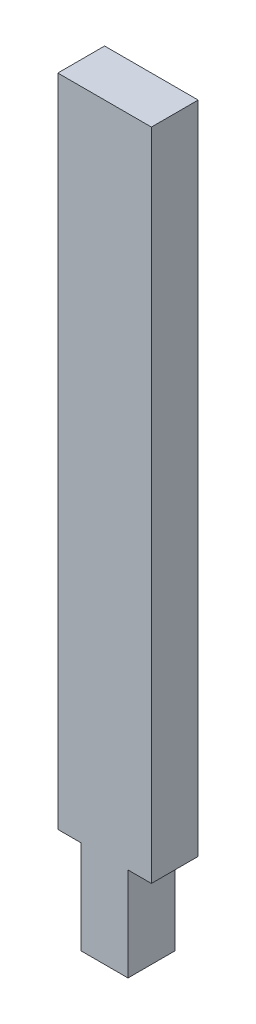
ISO-10303-21;
HEADER;
FILE_DESCRIPTION(('STEP AP214'),'2;1');
FILE_NAME('part.step','',(''),(''),'','','');
FILE_SCHEMA(('AUTOMOTIVE_DESIGN { 1 0 10303 214 1 1 1 1 }'));
ENDSEC;
DATA;
#1=APPLICATION_CONTEXT('core data for automotive mechanical design processes');
#2=APPLICATION_PROTOCOL_DEFINITION('international standard','automotive_design',2000,#1);
#3=PRODUCT_CONTEXT('',#1,'mechanical');
#4=PRODUCT('Part','Part','',(#3));
#5=PRODUCT_RELATED_PRODUCT_CATEGORY('part','',(#4));
#6=PRODUCT_DEFINITION_FORMATION('','',#4);
#7=PRODUCT_DEFINITION_CONTEXT('part definition',#1,'design');
#8=PRODUCT_DEFINITION('design','',#6,#7);
#9=PRODUCT_DEFINITION_SHAPE('','',#8);
#10=(LENGTH_UNIT() NAMED_UNIT(*) SI_UNIT(.MILLI.,.METRE.));
#11=(NAMED_UNIT(*) PLANE_ANGLE_UNIT() SI_UNIT($,.RADIAN.));
#12=(NAMED_UNIT(*) SI_UNIT($,.STERADIAN.) SOLID_ANGLE_UNIT());
#13=UNCERTAINTY_MEASURE_WITH_UNIT(LENGTH_MEASURE(1.E-05),#10,'distance_accuracy_value','');
#14=(GEOMETRIC_REPRESENTATION_CONTEXT(3) GLOBAL_UNCERTAINTY_ASSIGNED_CONTEXT((#13)) GLOBAL_UNIT_ASSIGNED_CONTEXT((#10,
#11,#12)) REPRESENTATION_CONTEXT('',''));
#15=CARTESIAN_POINT('',(0.,0.,0.));
#16=DIRECTION('',(0.,0.,1.));
#17=DIRECTION('',(1.,0.,0.));
#18=AXIS2_PLACEMENT_3D('',#15,#16,#17);
#19=CARTESIAN_POINT('',(0.,0.,5.));
#20=DIRECTION('',(1.,0.,0.));
#21=DIRECTION('',(0.,0.,-1.));
#22=AXIS2_PLACEMENT_3D('',#19,#20,#21);
#23=PLANE('',#22);
#24=DIRECTION('',(0.,-1.,0.));
#25=VECTOR('',#24,1.);
#26=CARTESIAN_POINT('',(0.,0.,0.));
#27=LINE('',#26,#25);
#28=CARTESIAN_POINT('',(0.,70.,0.));
#29=VERTEX_POINT('',#28);
#30=CARTESIAN_POINT('',(0.,0.,0.));
#31=VERTEX_POINT('',#30);
#32=EDGE_CURVE('E129',#29,#31,#27,.T.);
#33=ORIENTED_EDGE('',*,*,#32,.T.);
#34=DIRECTION('',(0.,0.,-1.));
#35=VECTOR('',#34,1.);
#36=CARTESIAN_POINT('',(0.,0.,5.));
#37=LINE('',#36,#35);
#38=CARTESIAN_POINT('',(0.,0.,5.));
#39=VERTEX_POINT('',#38);
#40=EDGE_CURVE('E11',#39,#31,#37,.T.);
#41=ORIENTED_EDGE('',*,*,#40,.F.);
#42=DIRECTION('',(0.,-1.,0.));
#43=VECTOR('',#42,1.);
#44=CARTESIAN_POINT('',(0.,0.,5.));
#45=LINE('',#44,#43);
#46=CARTESIAN_POINT('',(0.,70.,5.));
#47=VERTEX_POINT('',#46);
#48=EDGE_CURVE('E143',#47,#39,#45,.T.);
#49=ORIENTED_EDGE('',*,*,#48,.F.);
#50=DIRECTION('',(0.,0.,-1.));
#51=VECTOR('',#50,1.);
#52=CARTESIAN_POINT('',(0.,70.,5.));
#53=LINE('',#52,#51);
#54=EDGE_CURVE('E125',#47,#29,#53,.T.);
#55=ORIENTED_EDGE('',*,*,#54,.T.);
#56=EDGE_LOOP('',(#33,#41,#49,#55));
#57=FACE_BOUND('',#56,.T.);
#58=ADVANCED_FACE('F33',(#57),#23,.F.);
#59=CARTESIAN_POINT('',(0.,0.,5.));
#60=DIRECTION('',(0.,1.,0.));
#61=DIRECTION('',(0.,0.,1.));
#62=AXIS2_PLACEMENT_3D('',#59,#60,#61);
#63=PLANE('',#62);
#64=DIRECTION('',(1.,0.,0.));
#65=VECTOR('',#64,1.);
#66=CARTESIAN_POINT('',(0.,0.,0.));
#67=LINE('',#66,#65);
#68=CARTESIAN_POINT('',(2.5,0.,0.));
#69=VERTEX_POINT('',#68);
#70=EDGE_CURVE('E132',#31,#69,#67,.T.);
#71=ORIENTED_EDGE('',*,*,#70,.T.);
#72=DIRECTION('',(0.,0.,-1.));
#73=VECTOR('',#72,1.);
#74=CARTESIAN_POINT('',(2.5,0.,5.));
#75=LINE('',#74,#73);
#76=CARTESIAN_POINT('',(2.5,0.,5.));
#77=VERTEX_POINT('',#76);
#78=EDGE_CURVE('E41',#77,#69,#75,.T.);
#79=ORIENTED_EDGE('',*,*,#78,.F.);
#80=DIRECTION('',(1.,0.,0.));
#81=VECTOR('',#80,1.);
#82=CARTESIAN_POINT('',(0.,0.,5.));
#83=LINE('',#82,#81);
#84=EDGE_CURVE('E92',#39,#77,#83,.T.);
#85=ORIENTED_EDGE('',*,*,#84,.F.);
#86=ORIENTED_EDGE('',*,*,#40,.T.);
#87=EDGE_LOOP('',(#71,#79,#85,#86));
#88=FACE_BOUND('',#87,.T.);
#89=ADVANCED_FACE('F178',(#88),#63,.F.);
#90=CARTESIAN_POINT('',(2.5,0.,5.));
#91=DIRECTION('',(1.,0.,0.));
#92=DIRECTION('',(0.,1.,0.));
#93=AXIS2_PLACEMENT_3D('',#90,#91,#92);
#94=PLANE('',#93);
#95=DIRECTION('',(0.,-1.,0.));
#96=VECTOR('',#95,1.);
#97=CARTESIAN_POINT('',(2.5,0.,0.));
#98=LINE('',#97,#96);
#99=CARTESIAN_POINT('',(2.50000000000001,-10.,0.));
#100=VERTEX_POINT('',#99);
#101=EDGE_CURVE('E134',#69,#100,#98,.T.);
#102=ORIENTED_EDGE('',*,*,#101,.T.);
#103=DIRECTION('',(0.,0.,-1.));
#104=VECTOR('',#103,1.);
#105=CARTESIAN_POINT('',(2.50000000000001,-10.,5.));
#106=LINE('',#105,#104);
#107=CARTESIAN_POINT('',(2.50000000000001,-10.,5.));
#108=VERTEX_POINT('',#107);
#109=EDGE_CURVE('E150',#108,#100,#106,.T.);
#110=ORIENTED_EDGE('',*,*,#109,.F.);
#111=DIRECTION('',(0.,-1.,0.));
#112=VECTOR('',#111,1.);
#113=CARTESIAN_POINT('',(2.5,0.,5.));
#114=LINE('',#113,#112);
#115=EDGE_CURVE('E158',#77,#108,#114,.T.);
#116=ORIENTED_EDGE('',*,*,#115,.F.);
#117=ORIENTED_EDGE('',*,*,#78,.T.);
#118=EDGE_LOOP('',(#102,#110,#116,#117));
#119=FACE_BOUND('',#118,.T.);
#120=ADVANCED_FACE('F156',(#119),#94,.F.);
#121=CARTESIAN_POINT('',(2.50000000000001,-10.,5.));
#122=DIRECTION('',(0.,1.,0.));
#123=DIRECTION('',(0.,0.,1.));
#124=AXIS2_PLACEMENT_3D('',#121,#122,#123);
#125=PLANE('',#124);
#126=DIRECTION('',(1.,0.,0.));
#127=VECTOR('',#126,1.);
#128=CARTESIAN_POINT('',(2.50000000000001,-10.,0.));
#129=LINE('',#128,#127);
#130=CARTESIAN_POINT('',(7.50000000000001,-10.,0.));
#131=VERTEX_POINT('',#130);
#132=EDGE_CURVE('E136',#100,#131,#129,.T.);
#133=ORIENTED_EDGE('',*,*,#132,.T.);
#134=DIRECTION('',(0.,0.,-1.));
#135=VECTOR('',#134,1.);
#136=CARTESIAN_POINT('',(7.50000000000001,-10.,5.));
#137=LINE('',#136,#135);
#138=CARTESIAN_POINT('',(7.50000000000001,-10.,5.));
#139=VERTEX_POINT('',#138);
#140=EDGE_CURVE('E147',#139,#131,#137,.T.);
#141=ORIENTED_EDGE('',*,*,#140,.F.);
#142=DIRECTION('',(1.,0.,0.));
#143=VECTOR('',#142,1.);
#144=CARTESIAN_POINT('',(2.50000000000001,-10.,5.));
#145=LINE('',#144,#143);
#146=EDGE_CURVE('E170',#108,#139,#145,.T.);
#147=ORIENTED_EDGE('',*,*,#146,.F.);
#148=ORIENTED_EDGE('',*,*,#109,.T.);
#149=EDGE_LOOP('',(#133,#141,#147,#148));
#150=FACE_BOUND('',#149,.T.);
#151=ADVANCED_FACE('F166',(#150),#125,.F.);
#152=CARTESIAN_POINT('',(7.5,0.,5.));
#153=DIRECTION('',(-1.,0.,0.));
#154=DIRECTION('',(0.,-1.,0.));
#155=AXIS2_PLACEMENT_3D('',#152,#153,#154);
#156=PLANE('',#155);
#157=DIRECTION('',(0.,1.,0.));
#158=VECTOR('',#157,1.);
#159=CARTESIAN_POINT('',(7.5,0.,0.));
#160=LINE('',#159,#158);
#161=CARTESIAN_POINT('',(7.5,0.,0.));
#162=VERTEX_POINT('',#161);
#163=EDGE_CURVE('E138',#131,#162,#160,.T.);
#164=ORIENTED_EDGE('',*,*,#163,.T.);
#165=DIRECTION('',(0.,0.,-1.));
#166=VECTOR('',#165,1.);
#167=CARTESIAN_POINT('',(7.5,0.,5.));
#168=LINE('',#167,#166);
#169=CARTESIAN_POINT('',(7.5,0.,5.));
#170=VERTEX_POINT('',#169);
#171=EDGE_CURVE('E120',#170,#162,#168,.T.);
#172=ORIENTED_EDGE('',*,*,#171,.F.);
#173=DIRECTION('',(0.,1.,0.));
#174=VECTOR('',#173,1.);
#175=CARTESIAN_POINT('',(7.5,0.,5.));
#176=LINE('',#175,#174);
#177=EDGE_CURVE('E111',#139,#170,#176,.T.);
#178=ORIENTED_EDGE('',*,*,#177,.F.);
#179=ORIENTED_EDGE('',*,*,#140,.T.);
#180=EDGE_LOOP('',(#164,#172,#178,#179));
#181=FACE_BOUND('',#180,.T.);
#182=ADVANCED_FACE('F169',(#181),#156,.F.);
#183=CARTESIAN_POINT('',(7.5,0.,5.));
#184=DIRECTION('',(0.,1.,0.));
#185=DIRECTION('',(0.,0.,1.));
#186=AXIS2_PLACEMENT_3D('',#183,#184,#185);
#187=PLANE('',#186);
#188=DIRECTION('',(1.,0.,0.));
#189=VECTOR('',#188,1.);
#190=CARTESIAN_POINT('',(7.5,0.,0.));
#191=LINE('',#190,#189);
#192=CARTESIAN_POINT('',(9.99999999999999,0.,0.));
#193=VERTEX_POINT('',#192);
#194=EDGE_CURVE('E119',#162,#193,#191,.T.);
#195=ORIENTED_EDGE('',*,*,#194,.T.);
#196=DIRECTION('',(0.,0.,-1.));
#197=VECTOR('',#196,1.);
#198=CARTESIAN_POINT('',(9.99999999999999,0.,5.));
#199=LINE('',#198,#197);
#200=CARTESIAN_POINT('',(9.99999999999999,0.,5.));
#201=VERTEX_POINT('',#200);
#202=EDGE_CURVE('E116',#201,#193,#199,.T.);
#203=ORIENTED_EDGE('',*,*,#202,.F.);
#204=DIRECTION('',(1.,0.,0.));
#205=VECTOR('',#204,1.);
#206=CARTESIAN_POINT('',(7.5,0.,5.));
#207=LINE('',#206,#205);
#208=EDGE_CURVE('E105',#170,#201,#207,.T.);
#209=ORIENTED_EDGE('',*,*,#208,.F.);
#210=ORIENTED_EDGE('',*,*,#171,.T.);
#211=EDGE_LOOP('',(#195,#203,#209,#210));
#212=FACE_BOUND('',#211,.T.);
#213=ADVANCED_FACE('F117',(#212),#187,.F.);
#214=CARTESIAN_POINT('',(9.99999999999999,0.,5.));
#215=DIRECTION('',(-1.,0.,0.));
#216=DIRECTION('',(0.,0.,1.));
#217=AXIS2_PLACEMENT_3D('',#214,#215,#216);
#218=PLANE('',#217);
#219=DIRECTION('',(0.,1.,0.));
#220=VECTOR('',#219,1.);
#221=CARTESIAN_POINT('',(9.99999999999999,0.,0.));
#222=LINE('',#221,#220);
#223=CARTESIAN_POINT('',(9.99999999999999,70.,0.));
#224=VERTEX_POINT('',#223);
#225=EDGE_CURVE('E78',#193,#224,#222,.T.);
#226=ORIENTED_EDGE('',*,*,#225,.T.);
#227=DIRECTION('',(0.,0.,-1.));
#228=VECTOR('',#227,1.);
#229=CARTESIAN_POINT('',(9.99999999999999,70.,5.));
#230=LINE('',#229,#228);
#231=CARTESIAN_POINT('',(9.99999999999999,70.,5.));
#232=VERTEX_POINT('',#231);
#233=EDGE_CURVE('E121',#232,#224,#230,.T.);
#234=ORIENTED_EDGE('',*,*,#233,.F.);
#235=DIRECTION('',(0.,1.,0.));
#236=VECTOR('',#235,1.);
#237=CARTESIAN_POINT('',(9.99999999999999,0.,5.));
#238=LINE('',#237,#236);
#239=EDGE_CURVE('E109',#201,#232,#238,.T.);
#240=ORIENTED_EDGE('',*,*,#239,.F.);
#241=ORIENTED_EDGE('',*,*,#202,.T.);
#242=EDGE_LOOP('',(#226,#234,#240,#241));
#243=FACE_BOUND('',#242,.T.);
#244=ADVANCED_FACE('F123',(#243),#218,.F.);
#245=CARTESIAN_POINT('',(0.,70.,5.));
#246=DIRECTION('',(0.,-1.,0.));
#247=DIRECTION('',(0.,0.,-1.));
#248=AXIS2_PLACEMENT_3D('',#245,#246,#247);
#249=PLANE('',#248);
#250=DIRECTION('',(-1.,0.,0.));
#251=VECTOR('',#250,1.);
#252=CARTESIAN_POINT('',(0.,70.,0.));
#253=LINE('',#252,#251);
#254=EDGE_CURVE('E84',#224,#29,#253,.T.);
#255=ORIENTED_EDGE('',*,*,#254,.T.);
#256=ORIENTED_EDGE('',*,*,#54,.F.);
#257=DIRECTION('',(-1.,0.,0.));
#258=VECTOR('',#257,1.);
#259=CARTESIAN_POINT('',(0.,70.,5.));
#260=LINE('',#259,#258);
#261=EDGE_CURVE('E49',#232,#47,#260,.T.);
#262=ORIENTED_EDGE('',*,*,#261,.F.);
#263=ORIENTED_EDGE('',*,*,#233,.T.);
#264=EDGE_LOOP('',(#255,#256,#262,#263));
#265=FACE_BOUND('',#264,.T.);
#266=ADVANCED_FACE('F194',(#265),#249,.F.);
#267=CARTESIAN_POINT('',(0.,0.,5.));
#268=DIRECTION('',(0.,0.,-1.));
#269=DIRECTION('',(-1.,0.,0.));
#270=AXIS2_PLACEMENT_3D('',#267,#268,#269);
#271=PLANE('',#270);
#272=ORIENTED_EDGE('',*,*,#48,.T.);
#273=ORIENTED_EDGE('',*,*,#84,.T.);
#274=ORIENTED_EDGE('',*,*,#115,.T.);
#275=ORIENTED_EDGE('',*,*,#146,.T.);
#276=ORIENTED_EDGE('',*,*,#177,.T.);
#277=ORIENTED_EDGE('',*,*,#208,.T.);
#278=ORIENTED_EDGE('',*,*,#239,.T.);
#279=ORIENTED_EDGE('',*,*,#261,.T.);
#280=EDGE_LOOP('',(#272,#273,#274,#275,#276,#277,#278,#279));
#281=FACE_BOUND('',#280,.T.);
#282=ADVANCED_FACE('F107',(#281),#271,.F.);
#283=CARTESIAN_POINT('',(0.,0.,0.));
#284=DIRECTION('',(0.,0.,-1.));
#285=DIRECTION('',(-1.,0.,0.));
#286=AXIS2_PLACEMENT_3D('',#283,#284,#285);
#287=PLANE('',#286);
#288=ORIENTED_EDGE('',*,*,#32,.F.);
#289=ORIENTED_EDGE('',*,*,#254,.F.);
#290=ORIENTED_EDGE('',*,*,#225,.F.);
#291=ORIENTED_EDGE('',*,*,#194,.F.);
#292=ORIENTED_EDGE('',*,*,#163,.F.);
#293=ORIENTED_EDGE('',*,*,#132,.F.);
#294=ORIENTED_EDGE('',*,*,#101,.F.);
#295=ORIENTED_EDGE('',*,*,#70,.F.);
#296=EDGE_LOOP('',(#288,#289,#290,#291,#292,#293,#294,#295));
#297=FACE_BOUND('',#296,.T.);
#298=ADVANCED_FACE('F162',(#297),#287,.T.);
#299=CLOSED_SHELL('',(#58,#89,#120,#151,#182,#213,#244,#266,#282,#298));
#300=MANIFOLD_SOLID_BREP('B2',#299);
#301=ADVANCED_BREP_SHAPE_REPRESENTATION('',(#18,#300),#14);
#302=SHAPE_DEFINITION_REPRESENTATION(#9,#301);
ENDSEC;
END-ISO-10303-21;
